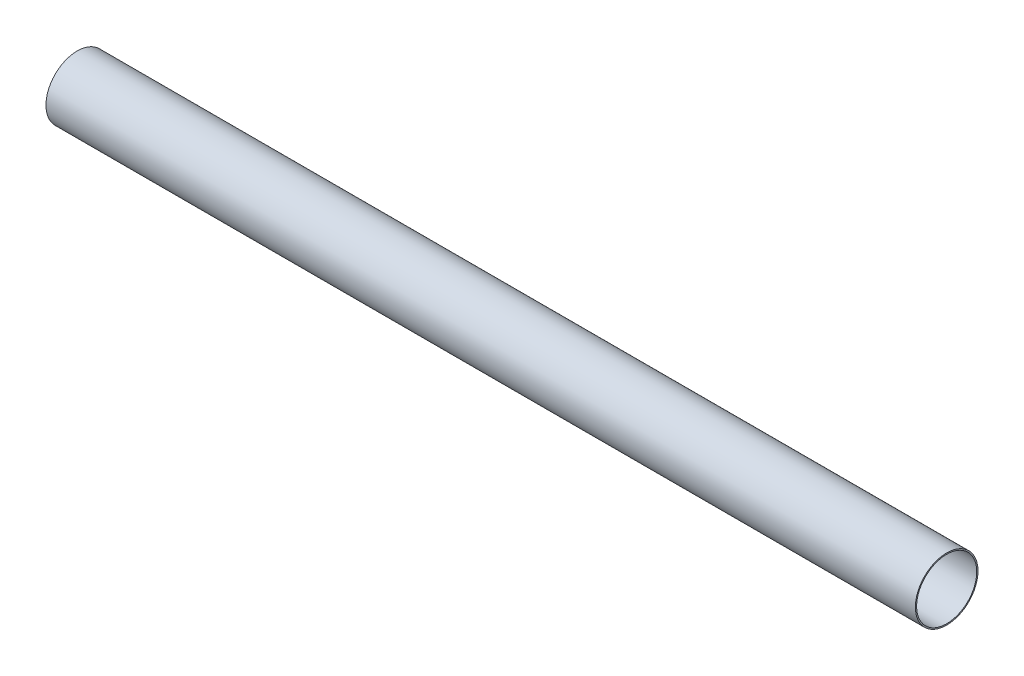
ISO-10303-21;
HEADER;
FILE_DESCRIPTION(('STEP AP214'),'2;1');
FILE_NAME('part.step','',(''),(''),'','','');
FILE_SCHEMA(('AUTOMOTIVE_DESIGN { 1 0 10303 214 1 1 1 1 }'));
ENDSEC;
DATA;
#1=APPLICATION_CONTEXT('core data for automotive mechanical design processes');
#2=APPLICATION_PROTOCOL_DEFINITION('international standard','automotive_design',2000,#1);
#3=PRODUCT_CONTEXT('',#1,'mechanical');
#4=PRODUCT('Part','Part','',(#3));
#5=PRODUCT_RELATED_PRODUCT_CATEGORY('part','',(#4));
#6=PRODUCT_DEFINITION_FORMATION('','',#4);
#7=PRODUCT_DEFINITION_CONTEXT('part definition',#1,'design');
#8=PRODUCT_DEFINITION('design','',#6,#7);
#9=PRODUCT_DEFINITION_SHAPE('','',#8);
#10=(LENGTH_UNIT() NAMED_UNIT(*) SI_UNIT(.MILLI.,.METRE.));
#11=(NAMED_UNIT(*) PLANE_ANGLE_UNIT() SI_UNIT($,.RADIAN.));
#12=(NAMED_UNIT(*) SI_UNIT($,.STERADIAN.) SOLID_ANGLE_UNIT());
#13=UNCERTAINTY_MEASURE_WITH_UNIT(LENGTH_MEASURE(1.E-05),#10,'distance_accuracy_value','');
#14=(GEOMETRIC_REPRESENTATION_CONTEXT(3) GLOBAL_UNCERTAINTY_ASSIGNED_CONTEXT((#13)) GLOBAL_UNIT_ASSIGNED_CONTEXT((#10,
#11,#12)) REPRESENTATION_CONTEXT('',''));
#15=CARTESIAN_POINT('',(0.,0.,0.));
#16=DIRECTION('',(0.,0.,1.));
#17=DIRECTION('',(1.,0.,0.));
#18=AXIS2_PLACEMENT_3D('',#15,#16,#17);
#19=CARTESIAN_POINT('',(0.,0.,-38.1));
#20=DIRECTION('',(-1.,0.,0.));
#21=DIRECTION('',(0.,0.,1.));
#22=AXIS2_PLACEMENT_3D('',#19,#20,#21);
#23=PLANE('',#22);
#24=CARTESIAN_POINT('',(0.,0.,0.));
#25=DIRECTION('',(1.,0.,0.));
#26=DIRECTION('',(0.,0.,-1.));
#27=AXIS2_PLACEMENT_3D('',#24,#25,#26);
#28=CIRCLE('',#27,38.1);
#29=CARTESIAN_POINT('',(0.,0.,-38.1));
#30=VERTEX_POINT('',#29);
#31=EDGE_CURVE('E56',#30,#30,#28,.T.);
#32=ORIENTED_EDGE('',*,*,#31,.T.);
#33=EDGE_LOOP('',(#32));
#34=FACE_BOUND('',#33,.T.);
#35=CARTESIAN_POINT('',(0.,0.,0.));
#36=DIRECTION('',(1.,0.,0.));
#37=DIRECTION('',(0.,0.,-1.));
#38=AXIS2_PLACEMENT_3D('',#35,#36,#37);
#39=CIRCLE('',#38,39.6875);
#40=CARTESIAN_POINT('',(0.,0.,-39.6875));
#41=VERTEX_POINT('',#40);
#42=EDGE_CURVE('E12',#41,#41,#39,.T.);
#43=ORIENTED_EDGE('',*,*,#42,.F.);
#44=EDGE_LOOP('',(#43));
#45=FACE_BOUND('',#44,.T.);
#46=ADVANCED_FACE('F42',(#34,#45),#23,.T.);
#47=CARTESIAN_POINT('',(0.,0.,0.));
#48=DIRECTION('',(1.,0.,0.));
#49=DIRECTION('',(0.,0.,-1.));
#50=AXIS2_PLACEMENT_3D('',#47,#48,#49);
#51=CYLINDRICAL_SURFACE('',#50,39.6875);
#52=ORIENTED_EDGE('',*,*,#42,.T.);
#53=EDGE_LOOP('',(#52));
#54=FACE_BOUND('',#53,.T.);
#55=CARTESIAN_POINT('',(1101.725,0.,0.));
#56=DIRECTION('',(1.,0.,0.));
#57=DIRECTION('',(0.,0.,-1.));
#58=AXIS2_PLACEMENT_3D('',#55,#56,#57);
#59=CIRCLE('',#58,39.6875);
#60=CARTESIAN_POINT('',(1101.725,0.,-39.6875));
#61=VERTEX_POINT('',#60);
#62=EDGE_CURVE('E48',#61,#61,#59,.T.);
#63=ORIENTED_EDGE('',*,*,#62,.F.);
#64=EDGE_LOOP('',(#63));
#65=FACE_BOUND('',#64,.T.);
#66=ADVANCED_FACE('F72',(#54,#65),#51,.T.);
#67=CARTESIAN_POINT('',(1101.725,0.,-39.6875));
#68=DIRECTION('',(1.,0.,0.));
#69=DIRECTION('',(0.,0.,-1.));
#70=AXIS2_PLACEMENT_3D('',#67,#68,#69);
#71=PLANE('',#70);
#72=ORIENTED_EDGE('',*,*,#62,.T.);
#73=EDGE_LOOP('',(#72));
#74=FACE_BOUND('',#73,.T.);
#75=CARTESIAN_POINT('',(1101.725,0.,0.));
#76=DIRECTION('',(1.,0.,0.));
#77=DIRECTION('',(0.,0.,-1.));
#78=AXIS2_PLACEMENT_3D('',#75,#76,#77);
#79=CIRCLE('',#78,38.0999999999966);
#80=CARTESIAN_POINT('',(1101.725,0.,-38.0999999999966));
#81=VERTEX_POINT('',#80);
#82=EDGE_CURVE('E52',#81,#81,#79,.T.);
#83=ORIENTED_EDGE('',*,*,#82,.F.);
#84=EDGE_LOOP('',(#83));
#85=FACE_BOUND('',#84,.T.);
#86=ADVANCED_FACE('F66',(#74,#85),#71,.T.);
#87=CARTESIAN_POINT('',(0.,0.,0.));
#88=DIRECTION('',(1.,0.,0.));
#89=DIRECTION('',(0.,0.,-1.));
#90=AXIS2_PLACEMENT_3D('',#87,#88,#89);
#91=CYLINDRICAL_SURFACE('',#90,38.0999999999983);
#92=ORIENTED_EDGE('',*,*,#82,.T.);
#93=EDGE_LOOP('',(#92));
#94=FACE_BOUND('',#93,.T.);
#95=ORIENTED_EDGE('',*,*,#31,.F.);
#96=EDGE_LOOP('',(#95));
#97=FACE_BOUND('',#96,.T.);
#98=ADVANCED_FACE('F64',(#94,#97),#91,.F.);
#99=CLOSED_SHELL('',(#46,#66,#86,#98));
#100=MANIFOLD_SOLID_BREP('B2',#99);
#101=ADVANCED_BREP_SHAPE_REPRESENTATION('',(#18,#100),#14);
#102=SHAPE_DEFINITION_REPRESENTATION(#9,#101);
ENDSEC;
END-ISO-10303-21;
